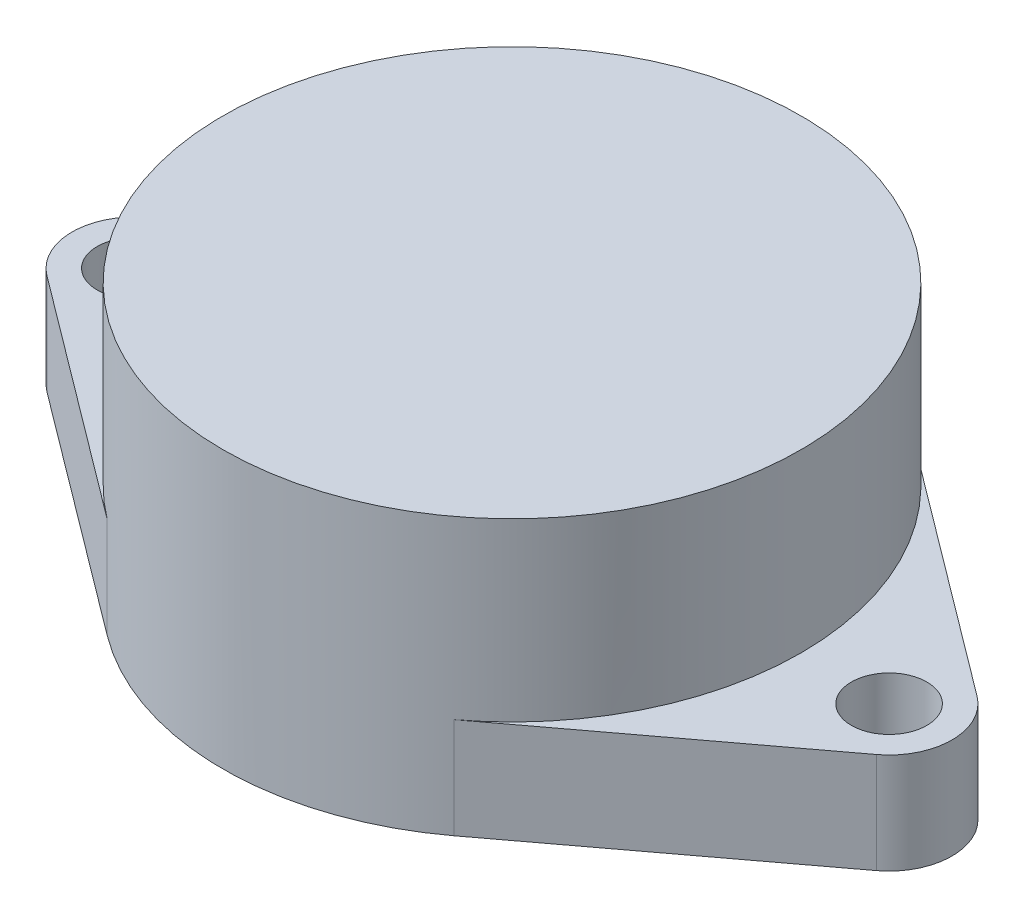
ISO-10303-21;
HEADER;
FILE_DESCRIPTION(('STEP AP214'),'2;1');
FILE_NAME('part.step','',(''),(''),'','','');
FILE_SCHEMA(('AUTOMOTIVE_DESIGN { 1 0 10303 214 1 1 1 1 }'));
ENDSEC;
DATA;
#1=APPLICATION_CONTEXT('core data for automotive mechanical design processes');
#2=APPLICATION_PROTOCOL_DEFINITION('international standard','automotive_design',2000,#1);
#3=PRODUCT_CONTEXT('',#1,'mechanical');
#4=PRODUCT('Part','Part','',(#3));
#5=PRODUCT_RELATED_PRODUCT_CATEGORY('part','',(#4));
#6=PRODUCT_DEFINITION_FORMATION('','',#4);
#7=PRODUCT_DEFINITION_CONTEXT('part definition',#1,'design');
#8=PRODUCT_DEFINITION('design','',#6,#7);
#9=PRODUCT_DEFINITION_SHAPE('','',#8);
#10=(LENGTH_UNIT() NAMED_UNIT(*) SI_UNIT(.MILLI.,.METRE.));
#11=(NAMED_UNIT(*) PLANE_ANGLE_UNIT() SI_UNIT($,.RADIAN.));
#12=(NAMED_UNIT(*) SI_UNIT($,.STERADIAN.) SOLID_ANGLE_UNIT());
#13=UNCERTAINTY_MEASURE_WITH_UNIT(LENGTH_MEASURE(1.E-05),#10,'distance_accuracy_value','');
#14=(GEOMETRIC_REPRESENTATION_CONTEXT(3) GLOBAL_UNCERTAINTY_ASSIGNED_CONTEXT((#13)) GLOBAL_UNIT_ASSIGNED_CONTEXT((#10,
#11,#12)) REPRESENTATION_CONTEXT('',''));
#15=CARTESIAN_POINT('',(0.,0.,0.));
#16=DIRECTION('',(0.,0.,1.));
#17=DIRECTION('',(1.,0.,0.));
#18=AXIS2_PLACEMENT_3D('',#15,#16,#17);
#19=CARTESIAN_POINT('',(15.,4.,0.));
#20=DIRECTION('',(0.,1.,0.));
#21=DIRECTION('',(0.,0.,1.));
#22=AXIS2_PLACEMENT_3D('',#19,#20,#21);
#23=PLANE('',#22);
#24=CARTESIAN_POINT('',(0.,4.,0.));
#25=DIRECTION('',(0.,1.,0.));
#26=DIRECTION('',(0.,0.,1.));
#27=AXIS2_PLACEMENT_3D('',#24,#25,#26);
#28=CIRCLE('',#27,11.5);
#29=CARTESIAN_POINT('',(6.9,4.,9.2));
#30=VERTEX_POINT('',#29);
#31=CARTESIAN_POINT('',(6.9,4.,-9.2));
#32=VERTEX_POINT('',#31);
#33=EDGE_CURVE('E44',#30,#32,#28,.T.);
#34=ORIENTED_EDGE('',*,*,#33,.F.);
#35=DIRECTION('',(0.8,0.,-0.6));
#36=VECTOR('',#35,1.);
#37=CARTESIAN_POINT('',(16.5,4.,2.));
#38=LINE('',#37,#36);
#39=CARTESIAN_POINT('',(16.5,4.,2.));
#40=VERTEX_POINT('',#39);
#41=EDGE_CURVE('E52',#30,#40,#38,.T.);
#42=ORIENTED_EDGE('',*,*,#41,.T.);
#43=CARTESIAN_POINT('',(15.,4.,0.));
#44=DIRECTION('',(0.,1.,0.));
#45=DIRECTION('',(0.,0.,1.));
#46=AXIS2_PLACEMENT_3D('',#43,#44,#45);
#47=CIRCLE('',#46,2.5);
#48=CARTESIAN_POINT('',(16.5,4.,-2.));
#49=VERTEX_POINT('',#48);
#50=EDGE_CURVE('E154',#40,#49,#47,.T.);
#51=ORIENTED_EDGE('',*,*,#50,.T.);
#52=DIRECTION('',(-0.8,0.,-0.6));
#53=VECTOR('',#52,1.);
#54=CARTESIAN_POINT('',(16.5,4.,-2.));
#55=LINE('',#54,#53);
#56=EDGE_CURVE('E98',#49,#32,#55,.T.);
#57=ORIENTED_EDGE('',*,*,#56,.T.);
#58=EDGE_LOOP('',(#34,#42,#51,#57));
#59=FACE_BOUND('',#58,.T.);
#60=CARTESIAN_POINT('',(15.,4.,0.));
#61=DIRECTION('',(0.,1.,0.));
#62=DIRECTION('',(0.,0.,1.));
#63=AXIS2_PLACEMENT_3D('',#60,#61,#62);
#64=CIRCLE('',#63,1.5);
#65=CARTESIAN_POINT('',(15.,4.,1.5));
#66=VERTEX_POINT('',#65);
#67=EDGE_CURVE('E186',#66,#66,#64,.T.);
#68=ORIENTED_EDGE('',*,*,#67,.F.);
#69=EDGE_LOOP('',(#68));
#70=FACE_BOUND('',#69,.T.);
#71=ADVANCED_FACE('F33',(#59,#70),#23,.T.);
#72=CARTESIAN_POINT('',(-6.9,4.,-9.2));
#73=VERTEX_POINT('',#72);
#74=CARTESIAN_POINT('',(-6.9,4.,9.2));
#75=VERTEX_POINT('',#74);
#76=EDGE_CURVE('E11',#73,#75,#28,.T.);
#77=ORIENTED_EDGE('',*,*,#76,.F.);
#78=DIRECTION('',(-0.8,0.,0.6));
#79=VECTOR('',#78,1.);
#80=CARTESIAN_POINT('',(-16.5,4.,-2.));
#81=LINE('',#80,#79);
#82=CARTESIAN_POINT('',(-16.5,4.,-2.));
#83=VERTEX_POINT('',#82);
#84=EDGE_CURVE('E118',#73,#83,#81,.T.);
#85=ORIENTED_EDGE('',*,*,#84,.T.);
#86=CARTESIAN_POINT('',(-15.,4.,0.));
#87=DIRECTION('',(0.,1.,0.));
#88=DIRECTION('',(0.,0.,1.));
#89=AXIS2_PLACEMENT_3D('',#86,#87,#88);
#90=CIRCLE('',#89,2.5);
#91=CARTESIAN_POINT('',(-16.5,4.,2.));
#92=VERTEX_POINT('',#91);
#93=EDGE_CURVE('E110',#83,#92,#90,.T.);
#94=ORIENTED_EDGE('',*,*,#93,.T.);
#95=DIRECTION('',(0.8,0.,0.6));
#96=VECTOR('',#95,1.);
#97=CARTESIAN_POINT('',(-16.5,4.,2.));
#98=LINE('',#97,#96);
#99=EDGE_CURVE('E115',#92,#75,#98,.T.);
#100=ORIENTED_EDGE('',*,*,#99,.T.);
#101=EDGE_LOOP('',(#77,#85,#94,#100));
#102=FACE_BOUND('',#101,.T.);
#103=CARTESIAN_POINT('',(-15.,4.,0.));
#104=DIRECTION('',(0.,1.,0.));
#105=DIRECTION('',(0.,0.,1.));
#106=AXIS2_PLACEMENT_3D('',#103,#104,#105);
#107=CIRCLE('',#106,1.5);
#108=CARTESIAN_POINT('',(-15.,4.,1.5));
#109=VERTEX_POINT('',#108);
#110=EDGE_CURVE('E143',#109,#109,#107,.T.);
#111=ORIENTED_EDGE('',*,*,#110,.F.);
#112=EDGE_LOOP('',(#111));
#113=FACE_BOUND('',#112,.T.);
#114=ADVANCED_FACE('F112',(#102,#113),#23,.T.);
#115=CARTESIAN_POINT('',(15.,0.,0.));
#116=DIRECTION('',(0.,1.,0.));
#117=DIRECTION('',(0.,0.,1.));
#118=AXIS2_PLACEMENT_3D('',#115,#116,#117);
#119=PLANE('',#118);
#120=CARTESIAN_POINT('',(15.,0.,0.));
#121=DIRECTION('',(0.,1.,0.));
#122=DIRECTION('',(0.,0.,1.));
#123=AXIS2_PLACEMENT_3D('',#120,#121,#122);
#124=CIRCLE('',#123,2.5);
#125=CARTESIAN_POINT('',(16.5,0.,2.));
#126=VERTEX_POINT('',#125);
#127=CARTESIAN_POINT('',(16.5,0.,-2.));
#128=VERTEX_POINT('',#127);
#129=EDGE_CURVE('E139',#126,#128,#124,.T.);
#130=ORIENTED_EDGE('',*,*,#129,.F.);
#131=DIRECTION('',(0.8,0.,-0.6));
#132=VECTOR('',#131,1.);
#133=CARTESIAN_POINT('',(16.5,0.,2.));
#134=LINE('',#133,#132);
#135=CARTESIAN_POINT('',(6.9,0.,9.2));
#136=VERTEX_POINT('',#135);
#137=EDGE_CURVE('E89',#136,#126,#134,.T.);
#138=ORIENTED_EDGE('',*,*,#137,.F.);
#139=CARTESIAN_POINT('',(0.,0.,0.));
#140=DIRECTION('',(0.,1.,0.));
#141=DIRECTION('',(0.,0.,1.));
#142=AXIS2_PLACEMENT_3D('',#139,#140,#141);
#143=CIRCLE('',#142,11.5);
#144=CARTESIAN_POINT('',(-6.9,0.,9.2));
#145=VERTEX_POINT('',#144);
#146=EDGE_CURVE('E83',#145,#136,#143,.T.);
#147=ORIENTED_EDGE('',*,*,#146,.F.);
#148=DIRECTION('',(0.8,0.,0.6));
#149=VECTOR('',#148,1.);
#150=CARTESIAN_POINT('',(-16.5,0.,2.));
#151=LINE('',#150,#149);
#152=CARTESIAN_POINT('',(-16.5,0.,2.));
#153=VERTEX_POINT('',#152);
#154=EDGE_CURVE('E150',#153,#145,#151,.T.);
#155=ORIENTED_EDGE('',*,*,#154,.F.);
#156=CARTESIAN_POINT('',(-15.,0.,0.));
#157=DIRECTION('',(0.,1.,0.));
#158=DIRECTION('',(0.,0.,1.));
#159=AXIS2_PLACEMENT_3D('',#156,#157,#158);
#160=CIRCLE('',#159,2.5);
#161=CARTESIAN_POINT('',(-16.5,0.,-2.));
#162=VERTEX_POINT('',#161);
#163=EDGE_CURVE('E127',#162,#153,#160,.T.);
#164=ORIENTED_EDGE('',*,*,#163,.F.);
#165=DIRECTION('',(-0.8,0.,0.6));
#166=VECTOR('',#165,1.);
#167=CARTESIAN_POINT('',(-16.5,0.,-2.));
#168=LINE('',#167,#166);
#169=CARTESIAN_POINT('',(-6.9,0.,-9.2));
#170=VERTEX_POINT('',#169);
#171=EDGE_CURVE('E147',#170,#162,#168,.T.);
#172=ORIENTED_EDGE('',*,*,#171,.F.);
#173=CARTESIAN_POINT('',(0.,0.,0.));
#174=DIRECTION('',(0.,1.,0.));
#175=DIRECTION('',(0.,0.,1.));
#176=AXIS2_PLACEMENT_3D('',#173,#174,#175);
#177=CIRCLE('',#176,11.5);
#178=CARTESIAN_POINT('',(6.9,0.,-9.2));
#179=VERTEX_POINT('',#178);
#180=EDGE_CURVE('E145',#179,#170,#177,.T.);
#181=ORIENTED_EDGE('',*,*,#180,.F.);
#182=DIRECTION('',(-0.8,0.,-0.6));
#183=VECTOR('',#182,1.);
#184=CARTESIAN_POINT('',(16.5,0.,-2.));
#185=LINE('',#184,#183);
#186=EDGE_CURVE('E142',#128,#179,#185,.T.);
#187=ORIENTED_EDGE('',*,*,#186,.F.);
#188=EDGE_LOOP('',(#130,#138,#147,#155,#164,#172,#181,#187));
#189=FACE_BOUND('',#188,.T.);
#190=CARTESIAN_POINT('',(-15.,0.,0.));
#191=DIRECTION('',(0.,1.,0.));
#192=DIRECTION('',(0.,0.,1.));
#193=AXIS2_PLACEMENT_3D('',#190,#191,#192);
#194=CIRCLE('',#193,1.5);
#195=CARTESIAN_POINT('',(-15.,0.,1.5));
#196=VERTEX_POINT('',#195);
#197=EDGE_CURVE('E183',#196,#196,#194,.T.);
#198=ORIENTED_EDGE('',*,*,#197,.T.);
#199=EDGE_LOOP('',(#198));
#200=FACE_BOUND('',#199,.T.);
#201=CARTESIAN_POINT('',(15.,0.,0.));
#202=DIRECTION('',(0.,1.,0.));
#203=DIRECTION('',(0.,0.,1.));
#204=AXIS2_PLACEMENT_3D('',#201,#202,#203);
#205=CIRCLE('',#204,1.5);
#206=CARTESIAN_POINT('',(15.,0.,1.5));
#207=VERTEX_POINT('',#206);
#208=EDGE_CURVE('E189',#207,#207,#205,.T.);
#209=ORIENTED_EDGE('',*,*,#208,.T.);
#210=EDGE_LOOP('',(#209));
#211=FACE_BOUND('',#210,.T.);
#212=ADVANCED_FACE('F172',(#189,#200,#211),#119,.F.);
#213=CARTESIAN_POINT('',(15.,4.,0.));
#214=DIRECTION('',(0.,-1.,0.));
#215=DIRECTION('',(0.,0.,-1.));
#216=AXIS2_PLACEMENT_3D('',#213,#214,#215);
#217=CYLINDRICAL_SURFACE('',#216,2.5);
#218=ORIENTED_EDGE('',*,*,#129,.T.);
#219=DIRECTION('',(0.,-1.,0.));
#220=VECTOR('',#219,1.);
#221=CARTESIAN_POINT('',(16.5,4.,-2.));
#222=LINE('',#221,#220);
#223=EDGE_CURVE('E37',#49,#128,#222,.T.);
#224=ORIENTED_EDGE('',*,*,#223,.F.);
#225=ORIENTED_EDGE('',*,*,#50,.F.);
#226=DIRECTION('',(0.,-1.,0.));
#227=VECTOR('',#226,1.);
#228=CARTESIAN_POINT('',(16.5,4.,2.));
#229=LINE('',#228,#227);
#230=EDGE_CURVE('E135',#40,#126,#229,.T.);
#231=ORIENTED_EDGE('',*,*,#230,.T.);
#232=EDGE_LOOP('',(#218,#224,#225,#231));
#233=FACE_BOUND('',#232,.T.);
#234=ADVANCED_FACE('F35',(#233),#217,.T.);
#235=CARTESIAN_POINT('',(16.5,4.,-2.));
#236=DIRECTION('',(-0.6,0.,0.8));
#237=DIRECTION('',(0.8,0.,0.6));
#238=AXIS2_PLACEMENT_3D('',#235,#236,#237);
#239=PLANE('',#238);
#240=ORIENTED_EDGE('',*,*,#186,.T.);
#241=DIRECTION('',(0.,-1.,0.));
#242=VECTOR('',#241,1.);
#243=CARTESIAN_POINT('',(6.9,4.,-9.2));
#244=LINE('',#243,#242);
#245=EDGE_CURVE('E162',#32,#179,#244,.T.);
#246=ORIENTED_EDGE('',*,*,#245,.F.);
#247=ORIENTED_EDGE('',*,*,#56,.F.);
#248=ORIENTED_EDGE('',*,*,#223,.T.);
#249=EDGE_LOOP('',(#240,#246,#247,#248));
#250=FACE_BOUND('',#249,.T.);
#251=ADVANCED_FACE('F167',(#250),#239,.F.);
#252=CARTESIAN_POINT('',(-16.5,4.,-2.));
#253=DIRECTION('',(0.6,0.,0.8));
#254=DIRECTION('',(0.8,0.,-0.6));
#255=AXIS2_PLACEMENT_3D('',#252,#253,#254);
#256=PLANE('',#255);
#257=ORIENTED_EDGE('',*,*,#171,.T.);
#258=DIRECTION('',(0.,-1.,0.));
#259=VECTOR('',#258,1.);
#260=CARTESIAN_POINT('',(-16.5,4.,-2.));
#261=LINE('',#260,#259);
#262=EDGE_CURVE('E130',#83,#162,#261,.T.);
#263=ORIENTED_EDGE('',*,*,#262,.F.);
#264=ORIENTED_EDGE('',*,*,#84,.F.);
#265=DIRECTION('',(0.,-1.,0.));
#266=VECTOR('',#265,1.);
#267=CARTESIAN_POINT('',(-6.9,4.,-9.2));
#268=LINE('',#267,#266);
#269=EDGE_CURVE('E160',#73,#170,#268,.T.);
#270=ORIENTED_EDGE('',*,*,#269,.T.);
#271=EDGE_LOOP('',(#257,#263,#264,#270));
#272=FACE_BOUND('',#271,.T.);
#273=ADVANCED_FACE('F179',(#272),#256,.F.);
#274=CARTESIAN_POINT('',(-15.,4.,0.));
#275=DIRECTION('',(0.,-1.,0.));
#276=DIRECTION('',(0.,0.,-1.));
#277=AXIS2_PLACEMENT_3D('',#274,#275,#276);
#278=CYLINDRICAL_SURFACE('',#277,2.5);
#279=ORIENTED_EDGE('',*,*,#163,.T.);
#280=DIRECTION('',(0.,-1.,0.));
#281=VECTOR('',#280,1.);
#282=CARTESIAN_POINT('',(-16.5,4.,2.));
#283=LINE('',#282,#281);
#284=EDGE_CURVE('E124',#92,#153,#283,.T.);
#285=ORIENTED_EDGE('',*,*,#284,.F.);
#286=ORIENTED_EDGE('',*,*,#93,.F.);
#287=ORIENTED_EDGE('',*,*,#262,.T.);
#288=EDGE_LOOP('',(#279,#285,#286,#287));
#289=FACE_BOUND('',#288,.T.);
#290=ADVANCED_FACE('F125',(#289),#278,.T.);
#291=CARTESIAN_POINT('',(-16.5,4.,2.));
#292=DIRECTION('',(0.6,0.,-0.8));
#293=DIRECTION('',(-0.8,0.,-0.6));
#294=AXIS2_PLACEMENT_3D('',#291,#292,#293);
#295=PLANE('',#294);
#296=ORIENTED_EDGE('',*,*,#154,.T.);
#297=DIRECTION('',(0.,-1.,0.));
#298=VECTOR('',#297,1.);
#299=CARTESIAN_POINT('',(-6.9,4.,9.2));
#300=LINE('',#299,#298);
#301=EDGE_CURVE('E131',#75,#145,#300,.T.);
#302=ORIENTED_EDGE('',*,*,#301,.F.);
#303=ORIENTED_EDGE('',*,*,#99,.F.);
#304=ORIENTED_EDGE('',*,*,#284,.T.);
#305=EDGE_LOOP('',(#296,#302,#303,#304));
#306=FACE_BOUND('',#305,.T.);
#307=ADVANCED_FACE('F133',(#306),#295,.F.);
#308=CARTESIAN_POINT('',(0.,4.,0.));
#309=DIRECTION('',(0.,-1.,0.));
#310=DIRECTION('',(0.,0.,-1.));
#311=AXIS2_PLACEMENT_3D('',#308,#309,#310);
#312=CYLINDRICAL_SURFACE('',#311,11.5);
#313=ORIENTED_EDGE('',*,*,#146,.T.);
#314=DIRECTION('',(0.,-1.,0.));
#315=VECTOR('',#314,1.);
#316=CARTESIAN_POINT('',(6.9,4.,9.2));
#317=LINE('',#316,#315);
#318=EDGE_CURVE('E156',#30,#136,#317,.T.);
#319=ORIENTED_EDGE('',*,*,#318,.F.);
#320=ORIENTED_EDGE('',*,*,#33,.T.);
#321=ORIENTED_EDGE('',*,*,#245,.T.);
#322=ORIENTED_EDGE('',*,*,#180,.T.);
#323=ORIENTED_EDGE('',*,*,#269,.F.);
#324=ORIENTED_EDGE('',*,*,#76,.T.);
#325=ORIENTED_EDGE('',*,*,#301,.T.);
#326=EDGE_LOOP('',(#313,#319,#320,#321,#322,#323,#324,#325));
#327=FACE_BOUND('',#326,.T.);
#328=CARTESIAN_POINT('',(0.,11.,0.));
#329=DIRECTION('',(0.,1.,0.));
#330=DIRECTION('',(0.,0.,1.));
#331=AXIS2_PLACEMENT_3D('',#328,#329,#330);
#332=CIRCLE('',#331,11.5);
#333=CARTESIAN_POINT('',(0.,11.,11.5));
#334=VERTEX_POINT('',#333);
#335=EDGE_CURVE('E192',#334,#334,#332,.T.);
#336=ORIENTED_EDGE('',*,*,#335,.F.);
#337=EDGE_LOOP('',(#336));
#338=FACE_BOUND('',#337,.T.);
#339=ADVANCED_FACE('F176',(#327,#338),#312,.T.);
#340=CARTESIAN_POINT('',(16.5,4.,2.));
#341=DIRECTION('',(-0.6,0.,-0.8));
#342=DIRECTION('',(-0.8,0.,0.6));
#343=AXIS2_PLACEMENT_3D('',#340,#341,#342);
#344=PLANE('',#343);
#345=ORIENTED_EDGE('',*,*,#137,.T.);
#346=ORIENTED_EDGE('',*,*,#230,.F.);
#347=ORIENTED_EDGE('',*,*,#41,.F.);
#348=ORIENTED_EDGE('',*,*,#318,.T.);
#349=EDGE_LOOP('',(#345,#346,#347,#348));
#350=FACE_BOUND('',#349,.T.);
#351=ADVANCED_FACE('F200',(#350),#344,.F.);
#352=CARTESIAN_POINT('',(-15.,4.,0.));
#353=DIRECTION('',(0.,-1.,0.));
#354=DIRECTION('',(0.,0.,-1.));
#355=AXIS2_PLACEMENT_3D('',#352,#353,#354);
#356=CYLINDRICAL_SURFACE('',#355,1.5);
#357=ORIENTED_EDGE('',*,*,#110,.T.);
#358=EDGE_LOOP('',(#357));
#359=FACE_BOUND('',#358,.T.);
#360=ORIENTED_EDGE('',*,*,#197,.F.);
#361=EDGE_LOOP('',(#360));
#362=FACE_BOUND('',#361,.T.);
#363=ADVANCED_FACE('F206',(#359,#362),#356,.F.);
#364=CARTESIAN_POINT('',(15.,4.,0.));
#365=DIRECTION('',(0.,-1.,0.));
#366=DIRECTION('',(0.,0.,-1.));
#367=AXIS2_PLACEMENT_3D('',#364,#365,#366);
#368=CYLINDRICAL_SURFACE('',#367,1.5);
#369=ORIENTED_EDGE('',*,*,#67,.T.);
#370=EDGE_LOOP('',(#369));
#371=FACE_BOUND('',#370,.T.);
#372=ORIENTED_EDGE('',*,*,#208,.F.);
#373=EDGE_LOOP('',(#372));
#374=FACE_BOUND('',#373,.T.);
#375=ADVANCED_FACE('F256',(#371,#374),#368,.F.);
#376=CARTESIAN_POINT('',(0.,11.,0.));
#377=DIRECTION('',(0.,1.,0.));
#378=DIRECTION('',(0.,0.,1.));
#379=AXIS2_PLACEMENT_3D('',#376,#377,#378);
#380=PLANE('',#379);
#381=ORIENTED_EDGE('',*,*,#335,.T.);
#382=EDGE_LOOP('',(#381));
#383=FACE_BOUND('',#382,.T.);
#384=ADVANCED_FACE('F198',(#383),#380,.T.);
#385=CLOSED_SHELL('',(#71,#114,#212,#234,#251,#273,#290,#307,#339,#351,#363,#375,#384));
#386=MANIFOLD_SOLID_BREP('B2',#385);
#387=ADVANCED_BREP_SHAPE_REPRESENTATION('',(#18,#386),#14);
#388=SHAPE_DEFINITION_REPRESENTATION(#9,#387);
ENDSEC;
END-ISO-10303-21;
